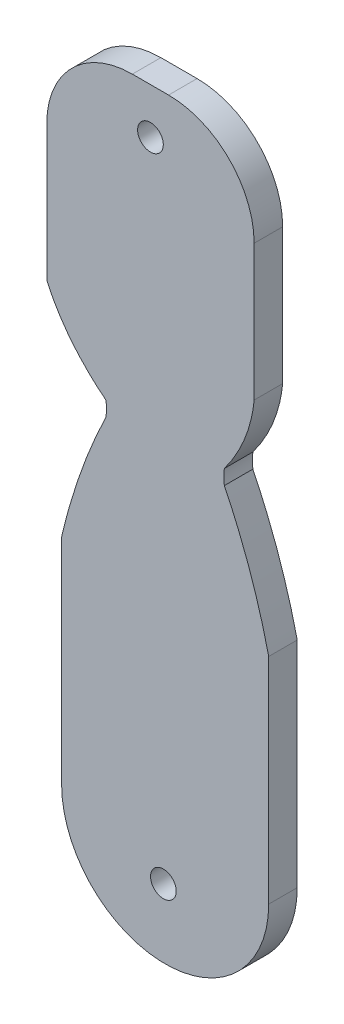
ISO-10303-21;
HEADER;
FILE_DESCRIPTION(('STEP AP214'),'2;1');
FILE_NAME('part.step','',(''),(''),'','','');
FILE_SCHEMA(('AUTOMOTIVE_DESIGN { 1 0 10303 214 1 1 1 1 }'));
ENDSEC;
DATA;
#1=APPLICATION_CONTEXT('core data for automotive mechanical design processes');
#2=APPLICATION_PROTOCOL_DEFINITION('international standard','automotive_design',2000,#1);
#3=PRODUCT_CONTEXT('',#1,'mechanical');
#4=PRODUCT('Part','Part','',(#3));
#5=PRODUCT_RELATED_PRODUCT_CATEGORY('part','',(#4));
#6=PRODUCT_DEFINITION_FORMATION('','',#4);
#7=PRODUCT_DEFINITION_CONTEXT('part definition',#1,'design');
#8=PRODUCT_DEFINITION('design','',#6,#7);
#9=PRODUCT_DEFINITION_SHAPE('','',#8);
#10=(LENGTH_UNIT() NAMED_UNIT(*) SI_UNIT(.MILLI.,.METRE.));
#11=(NAMED_UNIT(*) PLANE_ANGLE_UNIT() SI_UNIT($,.RADIAN.));
#12=(NAMED_UNIT(*) SI_UNIT($,.STERADIAN.) SOLID_ANGLE_UNIT());
#13=UNCERTAINTY_MEASURE_WITH_UNIT(LENGTH_MEASURE(1.E-05),#10,'distance_accuracy_value','');
#14=(GEOMETRIC_REPRESENTATION_CONTEXT(3) GLOBAL_UNCERTAINTY_ASSIGNED_CONTEXT((#13)) GLOBAL_UNIT_ASSIGNED_CONTEXT((#10,
#11,#12)) REPRESENTATION_CONTEXT('',''));
#15=CARTESIAN_POINT('',(0.,0.,0.));
#16=DIRECTION('',(0.,0.,1.));
#17=DIRECTION('',(1.,0.,0.));
#18=AXIS2_PLACEMENT_3D('',#15,#16,#17);
#19=CARTESIAN_POINT('',(0.,0.,5.));
#20=DIRECTION('',(0.,0.,-1.));
#21=DIRECTION('',(-1.,0.,0.));
#22=AXIS2_PLACEMENT_3D('',#19,#20,#21);
#23=CYLINDRICAL_SURFACE('',#22,18.15);
#24=CARTESIAN_POINT('',(0.,0.,0.));
#25=DIRECTION('',(0.,0.,1.));
#26=DIRECTION('',(1.,0.,0.));
#27=AXIS2_PLACEMENT_3D('',#24,#25,#26);
#28=CIRCLE('',#27,18.15);
#29=CARTESIAN_POINT('',(-18.15,0.,0.));
#30=VERTEX_POINT('',#29);
#31=CARTESIAN_POINT('',(18.15,0.,0.));
#32=VERTEX_POINT('',#31);
#33=EDGE_CURVE('E168',#30,#32,#28,.T.);
#34=ORIENTED_EDGE('',*,*,#33,.T.);
#35=DIRECTION('',(0.,0.,-1.));
#36=VECTOR('',#35,1.);
#37=CARTESIAN_POINT('',(18.15,0.,5.));
#38=LINE('',#37,#36);
#39=CARTESIAN_POINT('',(18.15,0.,5.));
#40=VERTEX_POINT('',#39);
#41=EDGE_CURVE('E148',#40,#32,#38,.T.);
#42=ORIENTED_EDGE('',*,*,#41,.F.);
#43=CARTESIAN_POINT('',(0.,0.,5.));
#44=DIRECTION('',(0.,0.,1.));
#45=DIRECTION('',(1.,0.,0.));
#46=AXIS2_PLACEMENT_3D('',#43,#44,#45);
#47=CIRCLE('',#46,18.15);
#48=CARTESIAN_POINT('',(-18.15,0.,5.));
#49=VERTEX_POINT('',#48);
#50=EDGE_CURVE('E155',#49,#40,#47,.T.);
#51=ORIENTED_EDGE('',*,*,#50,.F.);
#52=DIRECTION('',(0.,0.,-1.));
#53=VECTOR('',#52,1.);
#54=CARTESIAN_POINT('',(-18.15,0.,5.));
#55=LINE('',#54,#53);
#56=EDGE_CURVE('E259',#49,#30,#55,.T.);
#57=ORIENTED_EDGE('',*,*,#56,.T.);
#58=EDGE_LOOP('',(#34,#42,#51,#57));
#59=FACE_BOUND('',#58,.T.);
#60=ADVANCED_FACE('F39',(#59),#23,.T.);
#61=CARTESIAN_POINT('',(18.15,0.,5.));
#62=DIRECTION('',(-1.,0.,0.));
#63=DIRECTION('',(0.,-1.,0.));
#64=AXIS2_PLACEMENT_3D('',#61,#62,#63);
#65=PLANE('',#64);
#66=DIRECTION('',(0.,1.,0.));
#67=VECTOR('',#66,1.);
#68=CARTESIAN_POINT('',(18.15,0.,0.));
#69=LINE('',#68,#67);
#70=CARTESIAN_POINT('',(18.15,37.6,0.));
#71=VERTEX_POINT('',#70);
#72=EDGE_CURVE('E297',#32,#71,#69,.T.);
#73=ORIENTED_EDGE('',*,*,#72,.T.);
#74=DIRECTION('',(0.,0.,-1.));
#75=VECTOR('',#74,1.);
#76=CARTESIAN_POINT('',(18.15,37.6,5.));
#77=LINE('',#76,#75);
#78=CARTESIAN_POINT('',(18.15,37.6,5.));
#79=VERTEX_POINT('',#78);
#80=EDGE_CURVE('E151',#79,#71,#77,.T.);
#81=ORIENTED_EDGE('',*,*,#80,.F.);
#82=DIRECTION('',(0.,1.,0.));
#83=VECTOR('',#82,1.);
#84=CARTESIAN_POINT('',(18.15,0.,5.));
#85=LINE('',#84,#83);
#86=EDGE_CURVE('E144',#40,#79,#85,.T.);
#87=ORIENTED_EDGE('',*,*,#86,.F.);
#88=ORIENTED_EDGE('',*,*,#41,.T.);
#89=EDGE_LOOP('',(#73,#81,#87,#88));
#90=FACE_BOUND('',#89,.T.);
#91=ADVANCED_FACE('F146',(#90),#65,.F.);
#92=CARTESIAN_POINT('',(18.15,37.6,5.));
#93=CARTESIAN_POINT('',(15.4739707667338,49.1843138934874,5.));
#94=CARTESIAN_POINT('',(10.375,59.65,5.));
#95=B_SPLINE_CURVE_WITH_KNOTS('',2,(#92,#93,#94),.UNSPECIFIED.,.F.,.F.,(3,3),(0.,
0.61107935601188),.UNSPECIFIED.);
#96=DIRECTION('',(0.,0.,-1.));
#97=VECTOR('',#96,1.);
#98=SURFACE_OF_LINEAR_EXTRUSION('',#95,#97);
#99=CARTESIAN_POINT('',(18.15,37.6,0.));
#100=CARTESIAN_POINT('',(15.4739707667338,49.1843138934874,0.));
#101=CARTESIAN_POINT('',(10.375,59.65,0.));
#102=B_SPLINE_CURVE_WITH_KNOTS('',2,(#99,#100,#101),.UNSPECIFIED.,.F.,.F.,(3,3),(0.,
0.61107935601188),.UNSPECIFIED.);
#103=CARTESIAN_POINT('',(10.375,59.65,0.));
#104=VERTEX_POINT('',#103);
#105=EDGE_CURVE('E294',#71,#104,#102,.T.);
#106=ORIENTED_EDGE('',*,*,#105,.T.);
#107=DIRECTION('',(0.,0.,-1.));
#108=VECTOR('',#107,1.);
#109=CARTESIAN_POINT('',(10.375,59.65,5.));
#110=LINE('',#109,#108);
#111=CARTESIAN_POINT('',(10.375,59.65,5.));
#112=VERTEX_POINT('',#111);
#113=EDGE_CURVE('E176',#112,#104,#110,.T.);
#114=ORIENTED_EDGE('',*,*,#113,.F.);
#115=EDGE_CURVE('E154',#79,#112,#95,.T.);
#116=ORIENTED_EDGE('',*,*,#115,.F.);
#117=ORIENTED_EDGE('',*,*,#80,.T.);
#118=EDGE_LOOP('',(#106,#114,#116,#117));
#119=FACE_BOUND('',#118,.T.);
#120=ADVANCED_FACE('F383',(#119),#98,.F.);
#121=CARTESIAN_POINT('',(10.375,59.65,5.));
#122=CARTESIAN_POINT('',(10.1823050694559,61.0080122238193,5.));
#123=CARTESIAN_POINT('',(10.375,62.25,5.));
#124=B_SPLINE_CURVE_WITH_KNOTS('',2,(#121,#122,#123),.UNSPECIFIED.,.F.,.F.,(3,3),(0.,
0.268489530863838),.UNSPECIFIED.);
#125=DIRECTION('',(0.,0.,-1.));
#126=VECTOR('',#125,1.);
#127=SURFACE_OF_LINEAR_EXTRUSION('',#124,#126);
#128=CARTESIAN_POINT('',(10.375,59.65,0.));
#129=CARTESIAN_POINT('',(10.1823050694559,61.0080122238193,0.));
#130=CARTESIAN_POINT('',(10.375,62.25,0.));
#131=B_SPLINE_CURVE_WITH_KNOTS('',2,(#128,#129,#130),.UNSPECIFIED.,.F.,.F.,(3,3),(0.,
0.268489530863838),.UNSPECIFIED.);
#132=CARTESIAN_POINT('',(10.375,62.25,0.));
#133=VERTEX_POINT('',#132);
#134=EDGE_CURVE('E225',#104,#133,#131,.T.);
#135=ORIENTED_EDGE('',*,*,#134,.T.);
#136=DIRECTION('',(0.,0.,-1.));
#137=VECTOR('',#136,1.);
#138=CARTESIAN_POINT('',(10.375,62.25,5.));
#139=LINE('',#138,#137);
#140=CARTESIAN_POINT('',(10.375,62.25,5.));
#141=VERTEX_POINT('',#140);
#142=EDGE_CURVE('E280',#141,#133,#139,.T.);
#143=ORIENTED_EDGE('',*,*,#142,.F.);
#144=EDGE_CURVE('E291',#112,#141,#124,.T.);
#145=ORIENTED_EDGE('',*,*,#144,.F.);
#146=ORIENTED_EDGE('',*,*,#113,.T.);
#147=EDGE_LOOP('',(#135,#143,#145,#146));
#148=FACE_BOUND('',#147,.T.);
#149=ADVANCED_FACE('F289',(#148),#127,.F.);
#150=CARTESIAN_POINT('',(10.375,62.25,5.));
#151=CARTESIAN_POINT('',(14.9190657832697,68.3763547750851,5.));
#152=CARTESIAN_POINT('',(15.6,75.25,5.));
#153=B_SPLINE_CURVE_WITH_KNOTS('',2,(#150,#151,#152),.UNSPECIFIED.,.F.,.F.,(3,3),(0.,
0.739355323739587),.UNSPECIFIED.);
#154=DIRECTION('',(0.,0.,-1.));
#155=VECTOR('',#154,1.);
#156=SURFACE_OF_LINEAR_EXTRUSION('',#153,#155);
#157=CARTESIAN_POINT('',(10.375,62.25,0.));
#158=CARTESIAN_POINT('',(14.9190657832697,68.3763547750851,0.));
#159=CARTESIAN_POINT('',(15.6,75.25,0.));
#160=B_SPLINE_CURVE_WITH_KNOTS('',2,(#157,#158,#159),.UNSPECIFIED.,.F.,.F.,(3,3),(0.,
0.739355323739587),.UNSPECIFIED.);
#161=CARTESIAN_POINT('',(15.6,75.25,0.));
#162=VERTEX_POINT('',#161);
#163=EDGE_CURVE('E219',#133,#162,#160,.T.);
#164=ORIENTED_EDGE('',*,*,#163,.T.);
#165=DIRECTION('',(0.,0.,-1.));
#166=VECTOR('',#165,1.);
#167=CARTESIAN_POINT('',(15.6,75.25,5.));
#168=LINE('',#167,#166);
#169=CARTESIAN_POINT('',(15.6,75.25,5.));
#170=VERTEX_POINT('',#169);
#171=EDGE_CURVE('E217',#170,#162,#168,.T.);
#172=ORIENTED_EDGE('',*,*,#171,.F.);
#173=EDGE_CURVE('E362',#141,#170,#153,.T.);
#174=ORIENTED_EDGE('',*,*,#173,.F.);
#175=ORIENTED_EDGE('',*,*,#142,.T.);
#176=EDGE_LOOP('',(#164,#172,#174,#175));
#177=FACE_BOUND('',#176,.T.);
#178=ADVANCED_FACE('F376',(#177),#156,.F.);
#179=CARTESIAN_POINT('',(15.6,75.25,5.));
#180=DIRECTION('',(-1.,0.,0.));
#181=DIRECTION('',(0.,0.,1.));
#182=AXIS2_PLACEMENT_3D('',#179,#180,#181);
#183=PLANE('',#182);
#184=DIRECTION('',(0.,1.,0.));
#185=VECTOR('',#184,1.);
#186=CARTESIAN_POINT('',(15.6,75.25,0.));
#187=LINE('',#186,#185);
#188=CARTESIAN_POINT('',(15.6,99.05,0.));
#189=VERTEX_POINT('',#188);
#190=EDGE_CURVE('E212',#162,#189,#187,.T.);
#191=ORIENTED_EDGE('',*,*,#190,.T.);
#192=DIRECTION('',(0.,0.,-1.));
#193=VECTOR('',#192,1.);
#194=CARTESIAN_POINT('',(15.6,99.05,5.));
#195=LINE('',#194,#193);
#196=CARTESIAN_POINT('',(15.6,99.05,5.));
#197=VERTEX_POINT('',#196);
#198=EDGE_CURVE('E63',#189,#197,#195,.F.);
#199=ORIENTED_EDGE('',*,*,#198,.T.);
#200=DIRECTION('',(0.,1.,0.));
#201=VECTOR('',#200,1.);
#202=CARTESIAN_POINT('',(15.6,75.25,5.));
#203=LINE('',#202,#201);
#204=EDGE_CURVE('E196',#170,#197,#203,.T.);
#205=ORIENTED_EDGE('',*,*,#204,.F.);
#206=ORIENTED_EDGE('',*,*,#171,.T.);
#207=EDGE_LOOP('',(#191,#199,#205,#206));
#208=FACE_BOUND('',#207,.T.);
#209=ADVANCED_FACE('F215',(#208),#183,.F.);
#210=CARTESIAN_POINT('',(-20.75,114.05,5.));
#211=DIRECTION('',(0.,-1.,0.));
#212=DIRECTION('',(0.,0.,-1.));
#213=AXIS2_PLACEMENT_3D('',#210,#211,#212);
#214=PLANE('',#213);
#215=DIRECTION('',(-1.,0.,0.));
#216=VECTOR('',#215,1.);
#217=CARTESIAN_POINT('',(-20.75,114.05,5.));
#218=LINE('',#217,#216);
#219=CARTESIAN_POINT('',(0.6,114.05,5.));
#220=VERTEX_POINT('',#219);
#221=CARTESIAN_POINT('',(-5.75,114.05,5.));
#222=VERTEX_POINT('',#221);
#223=EDGE_CURVE('E195',#220,#222,#218,.T.);
#224=ORIENTED_EDGE('',*,*,#223,.F.);
#225=DIRECTION('',(0.,0.,-1.));
#226=VECTOR('',#225,1.);
#227=CARTESIAN_POINT('',(0.6,114.05,5.));
#228=LINE('',#227,#226);
#229=CARTESIAN_POINT('',(0.6,114.05,0.));
#230=VERTEX_POINT('',#229);
#231=EDGE_CURVE('E174',#220,#230,#228,.T.);
#232=ORIENTED_EDGE('',*,*,#231,.T.);
#233=DIRECTION('',(-1.,0.,0.));
#234=VECTOR('',#233,1.);
#235=CARTESIAN_POINT('',(-20.75,114.05,0.));
#236=LINE('',#235,#234);
#237=CARTESIAN_POINT('',(-5.75,114.05,0.));
#238=VERTEX_POINT('',#237);
#239=EDGE_CURVE('E213',#230,#238,#236,.T.);
#240=ORIENTED_EDGE('',*,*,#239,.T.);
#241=DIRECTION('',(0.,0.,-1.));
#242=VECTOR('',#241,1.);
#243=CARTESIAN_POINT('',(-5.75,114.05,5.));
#244=LINE('',#243,#242);
#245=EDGE_CURVE('E170',#238,#222,#244,.F.);
#246=ORIENTED_EDGE('',*,*,#245,.T.);
#247=EDGE_LOOP('',(#224,#232,#240,#246));
#248=FACE_BOUND('',#247,.T.);
#249=ADVANCED_FACE('F200',(#248),#214,.F.);
#250=CARTESIAN_POINT('',(-20.75,75.25,5.));
#251=DIRECTION('',(1.,0.,0.));
#252=DIRECTION('',(0.,0.,-1.));
#253=AXIS2_PLACEMENT_3D('',#250,#251,#252);
#254=PLANE('',#253);
#255=DIRECTION('',(0.,-1.,0.));
#256=VECTOR('',#255,1.);
#257=CARTESIAN_POINT('',(-20.75,75.25,5.));
#258=LINE('',#257,#256);
#259=CARTESIAN_POINT('',(-20.75,99.05,5.));
#260=VERTEX_POINT('',#259);
#261=CARTESIAN_POINT('',(-20.75,75.25,5.));
#262=VERTEX_POINT('',#261);
#263=EDGE_CURVE('E205',#260,#262,#258,.T.);
#264=ORIENTED_EDGE('',*,*,#263,.F.);
#265=DIRECTION('',(0.,0.,-1.));
#266=VECTOR('',#265,1.);
#267=CARTESIAN_POINT('',(-20.75,99.05,5.));
#268=LINE('',#267,#266);
#269=CARTESIAN_POINT('',(-20.75,99.05,0.));
#270=VERTEX_POINT('',#269);
#271=EDGE_CURVE('E11',#260,#270,#268,.T.);
#272=ORIENTED_EDGE('',*,*,#271,.T.);
#273=DIRECTION('',(0.,-1.,0.));
#274=VECTOR('',#273,1.);
#275=CARTESIAN_POINT('',(-20.75,75.25,0.));
#276=LINE('',#275,#274);
#277=CARTESIAN_POINT('',(-20.75,75.25,0.));
#278=VERTEX_POINT('',#277);
#279=EDGE_CURVE('E223',#270,#278,#276,.T.);
#280=ORIENTED_EDGE('',*,*,#279,.T.);
#281=DIRECTION('',(0.,0.,-1.));
#282=VECTOR('',#281,1.);
#283=CARTESIAN_POINT('',(-20.75,75.25,5.));
#284=LINE('',#283,#282);
#285=EDGE_CURVE('E274',#262,#278,#284,.T.);
#286=ORIENTED_EDGE('',*,*,#285,.F.);
#287=EDGE_LOOP('',(#264,#272,#280,#286));
#288=FACE_BOUND('',#287,.T.);
#289=ADVANCED_FACE('F346',(#288),#254,.F.);
#290=CARTESIAN_POINT('',(-20.75,75.25,5.));
#291=CARTESIAN_POINT('',(-17.3768644960412,67.7492050262677,5.));
#292=CARTESIAN_POINT('',(-10.375,62.25,5.));
#293=B_SPLINE_CURVE_WITH_KNOTS('',2,(#290,#291,#292),.UNSPECIFIED.,.F.,.F.,(3,3),(0.,
0.738516147782177),.UNSPECIFIED.);
#294=DIRECTION('',(0.,0.,-1.));
#295=VECTOR('',#294,1.);
#296=SURFACE_OF_LINEAR_EXTRUSION('',#293,#295);
#297=CARTESIAN_POINT('',(-20.75,75.25,0.));
#298=CARTESIAN_POINT('',(-17.3768644960412,67.7492050262677,0.));
#299=CARTESIAN_POINT('',(-10.375,62.25,0.));
#300=B_SPLINE_CURVE_WITH_KNOTS('',2,(#297,#298,#299),.UNSPECIFIED.,.F.,.F.,(3,3),(0.,
0.738516147782177),.UNSPECIFIED.);
#301=CARTESIAN_POINT('',(-10.375,62.25,0.));
#302=VERTEX_POINT('',#301);
#303=EDGE_CURVE('E233',#278,#302,#300,.T.);
#304=ORIENTED_EDGE('',*,*,#303,.T.);
#305=DIRECTION('',(0.,0.,-1.));
#306=VECTOR('',#305,1.);
#307=CARTESIAN_POINT('',(-10.375,62.25,5.));
#308=LINE('',#307,#306);
#309=CARTESIAN_POINT('',(-10.375,62.25,5.));
#310=VERTEX_POINT('',#309);
#311=EDGE_CURVE('E270',#310,#302,#308,.T.);
#312=ORIENTED_EDGE('',*,*,#311,.F.);
#313=EDGE_CURVE('E349',#262,#310,#293,.T.);
#314=ORIENTED_EDGE('',*,*,#313,.F.);
#315=ORIENTED_EDGE('',*,*,#285,.T.);
#316=EDGE_LOOP('',(#304,#312,#314,#315));
#317=FACE_BOUND('',#316,.T.);
#318=ADVANCED_FACE('F342',(#317),#296,.F.);
#319=CARTESIAN_POINT('',(-10.375,62.25,5.));
#320=CARTESIAN_POINT('',(-10.1823050694559,61.0080122238193,5.));
#321=CARTESIAN_POINT('',(-10.375,59.65,5.));
#322=B_SPLINE_CURVE_WITH_KNOTS('',2,(#319,#320,#321),.UNSPECIFIED.,.F.,.F.,(3,3),(0.,
0.268489530863838),.UNSPECIFIED.);
#323=DIRECTION('',(0.,0.,-1.));
#324=VECTOR('',#323,1.);
#325=SURFACE_OF_LINEAR_EXTRUSION('',#322,#324);
#326=CARTESIAN_POINT('',(-10.375,62.25,0.));
#327=CARTESIAN_POINT('',(-10.1823050694559,61.0080122238193,0.));
#328=CARTESIAN_POINT('',(-10.375,59.65,0.));
#329=B_SPLINE_CURVE_WITH_KNOTS('',2,(#326,#327,#328),.UNSPECIFIED.,.F.,.F.,(3,3),(0.,
0.268489530863838),.UNSPECIFIED.);
#330=CARTESIAN_POINT('',(-10.375,59.65,0.));
#331=VERTEX_POINT('',#330);
#332=EDGE_CURVE('E238',#302,#331,#329,.T.);
#333=ORIENTED_EDGE('',*,*,#332,.T.);
#334=DIRECTION('',(0.,0.,-1.));
#335=VECTOR('',#334,1.);
#336=CARTESIAN_POINT('',(-10.375,59.65,5.));
#337=LINE('',#336,#335);
#338=CARTESIAN_POINT('',(-10.375,59.65,5.));
#339=VERTEX_POINT('',#338);
#340=EDGE_CURVE('E266',#339,#331,#337,.T.);
#341=ORIENTED_EDGE('',*,*,#340,.F.);
#342=EDGE_CURVE('E323',#310,#339,#322,.T.);
#343=ORIENTED_EDGE('',*,*,#342,.F.);
#344=ORIENTED_EDGE('',*,*,#311,.T.);
#345=EDGE_LOOP('',(#333,#341,#343,#344));
#346=FACE_BOUND('',#345,.T.);
#347=ADVANCED_FACE('F337',(#346),#325,.F.);
#348=CARTESIAN_POINT('',(-10.375,59.65,5.));
#349=CARTESIAN_POINT('',(-15.4739707667338,49.1843138934874,5.));
#350=CARTESIAN_POINT('',(-18.15,37.6,5.));
#351=B_SPLINE_CURVE_WITH_KNOTS('',2,(#348,#349,#350),.UNSPECIFIED.,.F.,.F.,(3,3),(0.,
0.61107935601188),.UNSPECIFIED.);
#352=DIRECTION('',(0.,0.,-1.));
#353=VECTOR('',#352,1.);
#354=SURFACE_OF_LINEAR_EXTRUSION('',#351,#353);
#355=CARTESIAN_POINT('',(-10.375,59.65,0.));
#356=CARTESIAN_POINT('',(-15.4739707667338,49.1843138934874,0.));
#357=CARTESIAN_POINT('',(-18.15,37.6,0.));
#358=B_SPLINE_CURVE_WITH_KNOTS('',2,(#355,#356,#357),.UNSPECIFIED.,.F.,.F.,(3,3),(0.,
0.61107935601188),.UNSPECIFIED.);
#359=CARTESIAN_POINT('',(-18.15,37.6,0.));
#360=VERTEX_POINT('',#359);
#361=EDGE_CURVE('E246',#331,#360,#358,.T.);
#362=ORIENTED_EDGE('',*,*,#361,.T.);
#363=DIRECTION('',(0.,0.,-1.));
#364=VECTOR('',#363,1.);
#365=CARTESIAN_POINT('',(-18.15,37.6,5.));
#366=LINE('',#365,#364);
#367=CARTESIAN_POINT('',(-18.15,37.6,5.));
#368=VERTEX_POINT('',#367);
#369=EDGE_CURVE('E262',#368,#360,#366,.T.);
#370=ORIENTED_EDGE('',*,*,#369,.F.);
#371=EDGE_CURVE('E317',#339,#368,#351,.T.);
#372=ORIENTED_EDGE('',*,*,#371,.F.);
#373=ORIENTED_EDGE('',*,*,#340,.T.);
#374=EDGE_LOOP('',(#362,#370,#372,#373));
#375=FACE_BOUND('',#374,.T.);
#376=ADVANCED_FACE('F332',(#375),#354,.F.);
#377=CARTESIAN_POINT('',(-18.15,0.,5.));
#378=DIRECTION('',(1.,0.,0.));
#379=DIRECTION('',(0.,0.,-1.));
#380=AXIS2_PLACEMENT_3D('',#377,#378,#379);
#381=PLANE('',#380);
#382=DIRECTION('',(0.,-1.,0.));
#383=VECTOR('',#382,1.);
#384=CARTESIAN_POINT('',(-18.15,0.,0.));
#385=LINE('',#384,#383);
#386=EDGE_CURVE('E165',#360,#30,#385,.T.);
#387=ORIENTED_EDGE('',*,*,#386,.T.);
#388=ORIENTED_EDGE('',*,*,#56,.F.);
#389=DIRECTION('',(0.,-1.,0.));
#390=VECTOR('',#389,1.);
#391=CARTESIAN_POINT('',(-18.15,0.,5.));
#392=LINE('',#391,#390);
#393=EDGE_CURVE('E160',#368,#49,#392,.T.);
#394=ORIENTED_EDGE('',*,*,#393,.F.);
#395=ORIENTED_EDGE('',*,*,#369,.T.);
#396=EDGE_LOOP('',(#387,#388,#394,#395));
#397=FACE_BOUND('',#396,.T.);
#398=ADVANCED_FACE('F336',(#397),#381,.F.);
#399=CARTESIAN_POINT('',(0.,0.,5.));
#400=DIRECTION('',(0.,0.,1.));
#401=DIRECTION('',(1.,0.,0.));
#402=AXIS2_PLACEMENT_3D('',#399,#400,#401);
#403=PLANE('',#402);
#404=CARTESIAN_POINT('',(-0.310000000000001,-6.15,5.));
#405=DIRECTION('',(0.,0.,1.));
#406=DIRECTION('',(1.,0.,0.));
#407=AXIS2_PLACEMENT_3D('',#404,#405,#406);
#408=CIRCLE('',#407,2.25);
#409=CARTESIAN_POINT('',(1.94,-6.15,5.));
#410=VERTEX_POINT('',#409);
#411=EDGE_CURVE('E403',#410,#410,#408,.T.);
#412=ORIENTED_EDGE('',*,*,#411,.F.);
#413=EDGE_LOOP('',(#412));
#414=FACE_BOUND('',#413,.T.);
#415=CARTESIAN_POINT('',(-2.575,106.05,5.));
#416=DIRECTION('',(0.,0.,1.));
#417=DIRECTION('',(1.,0.,0.));
#418=AXIS2_PLACEMENT_3D('',#415,#416,#417);
#419=CIRCLE('',#418,2.25);
#420=CARTESIAN_POINT('',(-0.325000000000001,106.05,5.));
#421=VERTEX_POINT('',#420);
#422=EDGE_CURVE('E395',#421,#421,#419,.T.);
#423=ORIENTED_EDGE('',*,*,#422,.F.);
#424=EDGE_LOOP('',(#423));
#425=FACE_BOUND('',#424,.T.);
#426=ORIENTED_EDGE('',*,*,#204,.T.);
#427=CARTESIAN_POINT('',(0.6,99.05,5.));
#428=DIRECTION('',(0.,0.,1.));
#429=DIRECTION('',(1.,0.,0.));
#430=AXIS2_PLACEMENT_3D('',#427,#428,#429);
#431=CIRCLE('',#430,15.);
#432=EDGE_CURVE('E48',#197,#220,#431,.T.);
#433=ORIENTED_EDGE('',*,*,#432,.T.);
#434=ORIENTED_EDGE('',*,*,#223,.T.);
#435=CARTESIAN_POINT('',(-5.75,99.05,5.));
#436=DIRECTION('',(0.,0.,1.));
#437=DIRECTION('',(1.,0.,0.));
#438=AXIS2_PLACEMENT_3D('',#435,#436,#437);
#439=CIRCLE('',#438,15.);
#440=EDGE_CURVE('E55',#222,#260,#439,.T.);
#441=ORIENTED_EDGE('',*,*,#440,.T.);
#442=ORIENTED_EDGE('',*,*,#263,.T.);
#443=ORIENTED_EDGE('',*,*,#313,.T.);
#444=ORIENTED_EDGE('',*,*,#342,.T.);
#445=ORIENTED_EDGE('',*,*,#371,.T.);
#446=ORIENTED_EDGE('',*,*,#393,.T.);
#447=ORIENTED_EDGE('',*,*,#50,.T.);
#448=ORIENTED_EDGE('',*,*,#86,.T.);
#449=ORIENTED_EDGE('',*,*,#115,.T.);
#450=ORIENTED_EDGE('',*,*,#144,.T.);
#451=ORIENTED_EDGE('',*,*,#173,.T.);
#452=EDGE_LOOP('',(#426,#433,#434,#441,#442,#443,#444,#445,#446,#447,#448,#449,#450,#451));
#453=FACE_BOUND('',#452,.T.);
#454=ADVANCED_FACE('F158',(#414,#425,#453),#403,.T.);
#455=CARTESIAN_POINT('',(0.,0.,0.));
#456=DIRECTION('',(0.,0.,1.));
#457=DIRECTION('',(1.,0.,0.));
#458=AXIS2_PLACEMENT_3D('',#455,#456,#457);
#459=PLANE('',#458);
#460=CARTESIAN_POINT('',(-0.310000000000001,-6.15,0.));
#461=DIRECTION('',(0.,0.,1.));
#462=DIRECTION('',(1.,0.,0.));
#463=AXIS2_PLACEMENT_3D('',#460,#461,#462);
#464=CIRCLE('',#463,2.25);
#465=CARTESIAN_POINT('',(1.94,-6.15,0.));
#466=VERTEX_POINT('',#465);
#467=EDGE_CURVE('E314',#466,#466,#464,.T.);
#468=ORIENTED_EDGE('',*,*,#467,.T.);
#469=EDGE_LOOP('',(#468));
#470=FACE_BOUND('',#469,.T.);
#471=CARTESIAN_POINT('',(-2.575,106.05,0.));
#472=DIRECTION('',(0.,0.,1.));
#473=DIRECTION('',(1.,0.,0.));
#474=AXIS2_PLACEMENT_3D('',#471,#472,#473);
#475=CIRCLE('',#474,2.25);
#476=CARTESIAN_POINT('',(-0.325000000000001,106.05,0.));
#477=VERTEX_POINT('',#476);
#478=EDGE_CURVE('E399',#477,#477,#475,.T.);
#479=ORIENTED_EDGE('',*,*,#478,.T.);
#480=EDGE_LOOP('',(#479));
#481=FACE_BOUND('',#480,.T.);
#482=ORIENTED_EDGE('',*,*,#239,.F.);
#483=CARTESIAN_POINT('',(0.6,99.05,0.));
#484=DIRECTION('',(0.,0.,1.));
#485=DIRECTION('',(1.,0.,0.));
#486=AXIS2_PLACEMENT_3D('',#483,#484,#485);
#487=CIRCLE('',#486,15.);
#488=EDGE_CURVE('E186',#230,#189,#487,.F.);
#489=ORIENTED_EDGE('',*,*,#488,.T.);
#490=ORIENTED_EDGE('',*,*,#190,.F.);
#491=ORIENTED_EDGE('',*,*,#163,.F.);
#492=ORIENTED_EDGE('',*,*,#134,.F.);
#493=ORIENTED_EDGE('',*,*,#105,.F.);
#494=ORIENTED_EDGE('',*,*,#72,.F.);
#495=ORIENTED_EDGE('',*,*,#33,.F.);
#496=ORIENTED_EDGE('',*,*,#386,.F.);
#497=ORIENTED_EDGE('',*,*,#361,.F.);
#498=ORIENTED_EDGE('',*,*,#332,.F.);
#499=ORIENTED_EDGE('',*,*,#303,.F.);
#500=ORIENTED_EDGE('',*,*,#279,.F.);
#501=CARTESIAN_POINT('',(-5.75,99.05,0.));
#502=DIRECTION('',(0.,0.,1.));
#503=DIRECTION('',(1.,0.,0.));
#504=AXIS2_PLACEMENT_3D('',#501,#502,#503);
#505=CIRCLE('',#504,15.);
#506=EDGE_CURVE('E183',#270,#238,#505,.F.);
#507=ORIENTED_EDGE('',*,*,#506,.T.);
#508=EDGE_LOOP('',(#482,#489,#490,#491,#492,#493,#494,#495,#496,#497,#498,#499,#500,#507));
#509=FACE_BOUND('',#508,.T.);
#510=ADVANCED_FACE('F210',(#470,#481,#509),#459,.F.);
#511=CARTESIAN_POINT('',(-2.575,106.05,0.));
#512=DIRECTION('',(0.,0.,1.));
#513=DIRECTION('',(1.,0.,0.));
#514=AXIS2_PLACEMENT_3D('',#511,#512,#513);
#515=CYLINDRICAL_SURFACE('',#514,2.25);
#516=ORIENTED_EDGE('',*,*,#478,.F.);
#517=EDGE_LOOP('',(#516));
#518=FACE_BOUND('',#517,.T.);
#519=ORIENTED_EDGE('',*,*,#422,.T.);
#520=EDGE_LOOP('',(#519));
#521=FACE_BOUND('',#520,.T.);
#522=ADVANCED_FACE('F416',(#518,#521),#515,.F.);
#523=CARTESIAN_POINT('',(-0.310000000000001,-6.15,0.));
#524=DIRECTION('',(0.,0.,1.));
#525=DIRECTION('',(1.,0.,0.));
#526=AXIS2_PLACEMENT_3D('',#523,#524,#525);
#527=CYLINDRICAL_SURFACE('',#526,2.25);
#528=ORIENTED_EDGE('',*,*,#467,.F.);
#529=EDGE_LOOP('',(#528));
#530=FACE_BOUND('',#529,.T.);
#531=ORIENTED_EDGE('',*,*,#411,.T.);
#532=EDGE_LOOP('',(#531));
#533=FACE_BOUND('',#532,.T.);
#534=ADVANCED_FACE('F413',(#530,#533),#527,.F.);
#535=CARTESIAN_POINT('',(0.6,99.05,5.));
#536=DIRECTION('',(0.,0.,-1.));
#537=DIRECTION('',(-1.,0.,0.));
#538=AXIS2_PLACEMENT_3D('',#535,#536,#537);
#539=CYLINDRICAL_SURFACE('',#538,15.);
#540=ORIENTED_EDGE('',*,*,#432,.F.);
#541=ORIENTED_EDGE('',*,*,#198,.F.);
#542=ORIENTED_EDGE('',*,*,#488,.F.);
#543=ORIENTED_EDGE('',*,*,#231,.F.);
#544=EDGE_LOOP('',(#540,#541,#542,#543));
#545=FACE_BOUND('',#544,.T.);
#546=ADVANCED_FACE('F207',(#545),#539,.T.);
#547=CARTESIAN_POINT('',(-5.75,99.05,5.));
#548=DIRECTION('',(0.,0.,-1.));
#549=DIRECTION('',(-1.,0.,0.));
#550=AXIS2_PLACEMENT_3D('',#547,#548,#549);
#551=CYLINDRICAL_SURFACE('',#550,15.);
#552=ORIENTED_EDGE('',*,*,#440,.F.);
#553=ORIENTED_EDGE('',*,*,#245,.F.);
#554=ORIENTED_EDGE('',*,*,#506,.F.);
#555=ORIENTED_EDGE('',*,*,#271,.F.);
#556=EDGE_LOOP('',(#552,#553,#554,#555));
#557=FACE_BOUND('',#556,.T.);
#558=ADVANCED_FACE('F41',(#557),#551,.T.);
#559=CLOSED_SHELL('',(#60,#91,#120,#149,#178,#209,#249,#289,#318,#347,#376,#398,#454,#510,#522,
#534,#546,#558));
#560=MANIFOLD_SOLID_BREP('B2',#559);
#561=ADVANCED_BREP_SHAPE_REPRESENTATION('',(#18,#560),#14);
#562=SHAPE_DEFINITION_REPRESENTATION(#9,#561);
ENDSEC;
END-ISO-10303-21;
